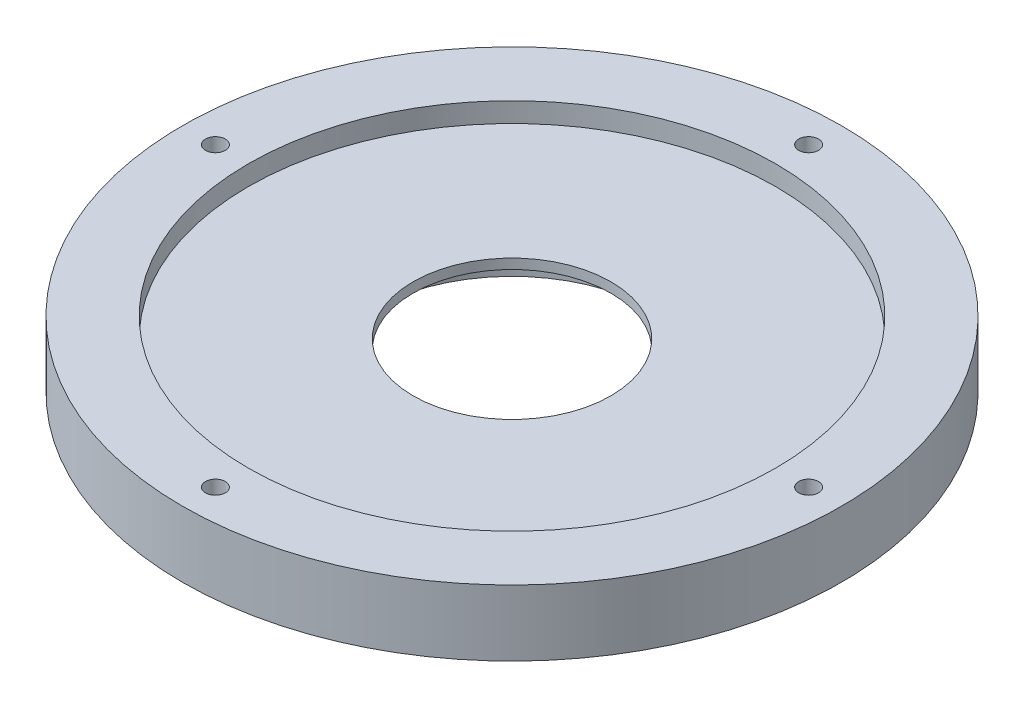
ISO-10303-21;
HEADER;
FILE_DESCRIPTION(('STEP AP214'),'2;1');
FILE_NAME('part.step','',(''),(''),'','','');
FILE_SCHEMA(('AUTOMOTIVE_DESIGN { 1 0 10303 214 1 1 1 1 }'));
ENDSEC;
DATA;
#1=APPLICATION_CONTEXT('core data for automotive mechanical design processes');
#2=APPLICATION_PROTOCOL_DEFINITION('international standard','automotive_design',2000,#1);
#3=PRODUCT_CONTEXT('',#1,'mechanical');
#4=PRODUCT('Part','Part','',(#3));
#5=PRODUCT_RELATED_PRODUCT_CATEGORY('part','',(#4));
#6=PRODUCT_DEFINITION_FORMATION('','',#4);
#7=PRODUCT_DEFINITION_CONTEXT('part definition',#1,'design');
#8=PRODUCT_DEFINITION('design','',#6,#7);
#9=PRODUCT_DEFINITION_SHAPE('','',#8);
#10=(LENGTH_UNIT() NAMED_UNIT(*) SI_UNIT(.MILLI.,.METRE.));
#11=(NAMED_UNIT(*) PLANE_ANGLE_UNIT() SI_UNIT($,.RADIAN.));
#12=(NAMED_UNIT(*) SI_UNIT($,.STERADIAN.) SOLID_ANGLE_UNIT());
#13=UNCERTAINTY_MEASURE_WITH_UNIT(LENGTH_MEASURE(1.E-05),#10,'distance_accuracy_value','');
#14=(GEOMETRIC_REPRESENTATION_CONTEXT(3) GLOBAL_UNCERTAINTY_ASSIGNED_CONTEXT((#13)) GLOBAL_UNIT_ASSIGNED_CONTEXT((#10,
#11,#12)) REPRESENTATION_CONTEXT('',''));
#15=CARTESIAN_POINT('',(0.,0.,0.));
#16=DIRECTION('',(0.,0.,1.));
#17=DIRECTION('',(1.,0.,0.));
#18=AXIS2_PLACEMENT_3D('',#15,#16,#17);
#19=CARTESIAN_POINT('',(0.,20.,0.));
#20=DIRECTION('',(0.,-1.,0.));
#21=DIRECTION('',(0.,0.,-1.));
#22=AXIS2_PLACEMENT_3D('',#19,#20,#21);
#23=CYLINDRICAL_SURFACE('',#22,30.);
#24=CARTESIAN_POINT('',(0.,11.,0.));
#25=DIRECTION('',(0.,-1.,0.));
#26=DIRECTION('',(0.,0.,-1.));
#27=AXIS2_PLACEMENT_3D('',#24,#25,#26);
#28=CIRCLE('',#27,30.);
#29=CARTESIAN_POINT('',(0.,11.,-30.));
#30=VERTEX_POINT('',#29);
#31=EDGE_CURVE('E60',#30,#30,#28,.T.);
#32=ORIENTED_EDGE('',*,*,#31,.T.);
#33=EDGE_LOOP('',(#32));
#34=FACE_BOUND('',#33,.T.);
#35=CARTESIAN_POINT('',(0.,14.,0.));
#36=DIRECTION('',(0.,1.,0.));
#37=DIRECTION('',(0.,0.,1.));
#38=AXIS2_PLACEMENT_3D('',#35,#36,#37);
#39=CIRCLE('',#38,30.);
#40=CARTESIAN_POINT('',(0.,14.,30.));
#41=VERTEX_POINT('',#40);
#42=EDGE_CURVE('E43',#41,#41,#39,.T.);
#43=ORIENTED_EDGE('',*,*,#42,.T.);
#44=EDGE_LOOP('',(#43));
#45=FACE_BOUND('',#44,.T.);
#46=ADVANCED_FACE('F39',(#34,#45),#23,.F.);
#47=CARTESIAN_POINT('',(0.,20.,0.));
#48=DIRECTION('',(0.,1.,0.));
#49=DIRECTION('',(0.,0.,1.));
#50=AXIS2_PLACEMENT_3D('',#47,#48,#49);
#51=PLANE('',#50);
#52=CARTESIAN_POINT('',(0.,20.,0.));
#53=DIRECTION('',(0.,1.,0.));
#54=DIRECTION('',(0.,0.,1.));
#55=AXIS2_PLACEMENT_3D('',#52,#53,#54);
#56=CIRCLE('',#55,80.);
#57=CARTESIAN_POINT('',(0.,20.,80.));
#58=VERTEX_POINT('',#57);
#59=EDGE_CURVE('E75',#58,#58,#56,.T.);
#60=ORIENTED_EDGE('',*,*,#59,.F.);
#61=EDGE_LOOP('',(#60));
#62=FACE_BOUND('',#61,.T.);
#63=CARTESIAN_POINT('',(-6.28466640991764E-13,20.,90.));
#64=DIRECTION('',(0.,1.,0.));
#65=DIRECTION('',(0.,0.,1.));
#66=AXIS2_PLACEMENT_3D('',#63,#64,#65);
#67=CIRCLE('',#66,3.);
#68=CARTESIAN_POINT('',(-6.28466640991764E-13,20.,93.));
#69=VERTEX_POINT('',#68);
#70=EDGE_CURVE('E78',#69,#69,#67,.T.);
#71=ORIENTED_EDGE('',*,*,#70,.F.);
#72=EDGE_LOOP('',(#71));
#73=FACE_BOUND('',#72,.T.);
#74=CARTESIAN_POINT('',(0.,20.,0.));
#75=DIRECTION('',(0.,1.,0.));
#76=DIRECTION('',(0.,0.,1.));
#77=AXIS2_PLACEMENT_3D('',#74,#75,#76);
#78=CIRCLE('',#77,100.);
#79=CARTESIAN_POINT('',(0.,20.,100.));
#80=VERTEX_POINT('',#79);
#81=EDGE_CURVE('E10',#80,#80,#78,.T.);
#82=ORIENTED_EDGE('',*,*,#81,.T.);
#83=EDGE_LOOP('',(#82));
#84=FACE_BOUND('',#83,.T.);
#85=CARTESIAN_POINT('',(0.,20.,-90.));
#86=DIRECTION('',(0.,1.,0.));
#87=DIRECTION('',(0.,0.,1.));
#88=AXIS2_PLACEMENT_3D('',#85,#86,#87);
#89=CIRCLE('',#88,3.);
#90=CARTESIAN_POINT('',(0.,20.,-87.));
#91=VERTEX_POINT('',#90);
#92=EDGE_CURVE('E55',#91,#91,#89,.T.);
#93=ORIENTED_EDGE('',*,*,#92,.F.);
#94=EDGE_LOOP('',(#93));
#95=FACE_BOUND('',#94,.T.);
#96=CARTESIAN_POINT('',(90.,20.,3.14233320495882E-13));
#97=DIRECTION('',(0.,1.,0.));
#98=DIRECTION('',(0.,0.,1.));
#99=AXIS2_PLACEMENT_3D('',#96,#97,#98);
#100=CIRCLE('',#99,3.);
#101=CARTESIAN_POINT('',(90.,20.,3.00000000000031));
#102=VERTEX_POINT('',#101);
#103=EDGE_CURVE('E87',#102,#102,#100,.T.);
#104=ORIENTED_EDGE('',*,*,#103,.F.);
#105=EDGE_LOOP('',(#104));
#106=FACE_BOUND('',#105,.T.);
#107=CARTESIAN_POINT('',(-90.,20.,-9.42699961487646E-13));
#108=DIRECTION('',(0.,1.,0.));
#109=DIRECTION('',(0.,0.,1.));
#110=AXIS2_PLACEMENT_3D('',#107,#108,#109);
#111=CIRCLE('',#110,3.);
#112=CARTESIAN_POINT('',(-90.,20.,2.99999999999906));
#113=VERTEX_POINT('',#112);
#114=EDGE_CURVE('E61',#113,#113,#111,.T.);
#115=ORIENTED_EDGE('',*,*,#114,.F.);
#116=EDGE_LOOP('',(#115));
#117=FACE_BOUND('',#116,.T.);
#118=ADVANCED_FACE('F112',(#62,#73,#84,#95,#106,#117),#51,.T.);
#119=CARTESIAN_POINT('',(0.,0.,0.));
#120=DIRECTION('',(0.,1.,0.));
#121=DIRECTION('',(0.,0.,1.));
#122=AXIS2_PLACEMENT_3D('',#119,#120,#121);
#123=PLANE('',#122);
#124=CARTESIAN_POINT('',(0.,0.,0.));
#125=DIRECTION('',(0.,-1.,0.));
#126=DIRECTION('',(0.,0.,-1.));
#127=AXIS2_PLACEMENT_3D('',#124,#125,#126);
#128=CIRCLE('',#127,43.);
#129=CARTESIAN_POINT('',(0.,0.,-43.));
#130=VERTEX_POINT('',#129);
#131=EDGE_CURVE('E70',#130,#130,#128,.T.);
#132=ORIENTED_EDGE('',*,*,#131,.F.);
#133=EDGE_LOOP('',(#132));
#134=FACE_BOUND('',#133,.T.);
#135=CARTESIAN_POINT('',(0.,0.,0.));
#136=DIRECTION('',(0.,1.,0.));
#137=DIRECTION('',(0.,0.,1.));
#138=AXIS2_PLACEMENT_3D('',#135,#136,#137);
#139=CIRCLE('',#138,100.);
#140=CARTESIAN_POINT('',(0.,0.,100.));
#141=VERTEX_POINT('',#140);
#142=EDGE_CURVE('E50',#141,#141,#139,.T.);
#143=ORIENTED_EDGE('',*,*,#142,.F.);
#144=EDGE_LOOP('',(#143));
#145=FACE_BOUND('',#144,.T.);
#146=CARTESIAN_POINT('',(0.,0.,-90.));
#147=DIRECTION('',(0.,1.,0.));
#148=DIRECTION('',(0.,0.,1.));
#149=AXIS2_PLACEMENT_3D('',#146,#147,#148);
#150=CIRCLE('',#149,3.);
#151=CARTESIAN_POINT('',(0.,0.,-87.));
#152=VERTEX_POINT('',#151);
#153=EDGE_CURVE('E54',#152,#152,#150,.T.);
#154=ORIENTED_EDGE('',*,*,#153,.T.);
#155=EDGE_LOOP('',(#154));
#156=FACE_BOUND('',#155,.T.);
#157=CARTESIAN_POINT('',(90.,0.,3.14233320495882E-13));
#158=DIRECTION('',(0.,1.,0.));
#159=DIRECTION('',(0.,0.,1.));
#160=AXIS2_PLACEMENT_3D('',#157,#158,#159);
#161=CIRCLE('',#160,3.);
#162=CARTESIAN_POINT('',(90.,0.,3.00000000000031));
#163=VERTEX_POINT('',#162);
#164=EDGE_CURVE('E84',#163,#163,#161,.T.);
#165=ORIENTED_EDGE('',*,*,#164,.T.);
#166=EDGE_LOOP('',(#165));
#167=FACE_BOUND('',#166,.T.);
#168=CARTESIAN_POINT('',(-6.28466640991764E-13,0.,90.));
#169=DIRECTION('',(0.,1.,0.));
#170=DIRECTION('',(0.,0.,1.));
#171=AXIS2_PLACEMENT_3D('',#168,#169,#170);
#172=CIRCLE('',#171,3.);
#173=CARTESIAN_POINT('',(-6.28466640991764E-13,0.,93.));
#174=VERTEX_POINT('',#173);
#175=EDGE_CURVE('E76',#174,#174,#172,.T.);
#176=ORIENTED_EDGE('',*,*,#175,.T.);
#177=EDGE_LOOP('',(#176));
#178=FACE_BOUND('',#177,.T.);
#179=CARTESIAN_POINT('',(-90.,0.,-9.42699961487646E-13));
#180=DIRECTION('',(0.,1.,0.));
#181=DIRECTION('',(0.,0.,1.));
#182=AXIS2_PLACEMENT_3D('',#179,#180,#181);
#183=CIRCLE('',#182,3.);
#184=CARTESIAN_POINT('',(-90.,0.,2.99999999999906));
#185=VERTEX_POINT('',#184);
#186=EDGE_CURVE('E56',#185,#185,#183,.T.);
#187=ORIENTED_EDGE('',*,*,#186,.T.);
#188=EDGE_LOOP('',(#187));
#189=FACE_BOUND('',#188,.T.);
#190=ADVANCED_FACE('F98',(#134,#145,#156,#167,#178,#189),#123,.F.);
#191=CARTESIAN_POINT('',(0.,20.,0.));
#192=DIRECTION('',(0.,-1.,0.));
#193=DIRECTION('',(0.,0.,-1.));
#194=AXIS2_PLACEMENT_3D('',#191,#192,#193);
#195=CYLINDRICAL_SURFACE('',#194,100.);
#196=ORIENTED_EDGE('',*,*,#81,.F.);
#197=EDGE_LOOP('',(#196));
#198=FACE_BOUND('',#197,.T.);
#199=ORIENTED_EDGE('',*,*,#142,.T.);
#200=EDGE_LOOP('',(#199));
#201=FACE_BOUND('',#200,.T.);
#202=ADVANCED_FACE('F41',(#198,#201),#195,.T.);
#203=CARTESIAN_POINT('',(0.,20.,-90.));
#204=DIRECTION('',(0.,-1.,0.));
#205=DIRECTION('',(0.,0.,-1.));
#206=AXIS2_PLACEMENT_3D('',#203,#204,#205);
#207=CYLINDRICAL_SURFACE('',#206,3.);
#208=ORIENTED_EDGE('',*,*,#92,.T.);
#209=EDGE_LOOP('',(#208));
#210=FACE_BOUND('',#209,.T.);
#211=ORIENTED_EDGE('',*,*,#153,.F.);
#212=EDGE_LOOP('',(#211));
#213=FACE_BOUND('',#212,.T.);
#214=ADVANCED_FACE('F100',(#210,#213),#207,.F.);
#215=CARTESIAN_POINT('',(90.,20.,3.14233320495882E-13));
#216=DIRECTION('',(0.,-1.,0.));
#217=DIRECTION('',(0.,0.,-1.));
#218=AXIS2_PLACEMENT_3D('',#215,#216,#217);
#219=CYLINDRICAL_SURFACE('',#218,3.);
#220=ORIENTED_EDGE('',*,*,#103,.T.);
#221=EDGE_LOOP('',(#220));
#222=FACE_BOUND('',#221,.T.);
#223=ORIENTED_EDGE('',*,*,#164,.F.);
#224=EDGE_LOOP('',(#223));
#225=FACE_BOUND('',#224,.T.);
#226=ADVANCED_FACE('F103',(#222,#225),#219,.F.);
#227=CARTESIAN_POINT('',(-6.28466640991764E-13,20.,90.));
#228=DIRECTION('',(0.,-1.,0.));
#229=DIRECTION('',(0.,0.,-1.));
#230=AXIS2_PLACEMENT_3D('',#227,#228,#229);
#231=CYLINDRICAL_SURFACE('',#230,3.);
#232=ORIENTED_EDGE('',*,*,#70,.T.);
#233=EDGE_LOOP('',(#232));
#234=FACE_BOUND('',#233,.T.);
#235=ORIENTED_EDGE('',*,*,#175,.F.);
#236=EDGE_LOOP('',(#235));
#237=FACE_BOUND('',#236,.T.);
#238=ADVANCED_FACE('F110',(#234,#237),#231,.F.);
#239=CARTESIAN_POINT('',(-90.,20.,-9.42699961487646E-13));
#240=DIRECTION('',(0.,-1.,0.));
#241=DIRECTION('',(0.,0.,-1.));
#242=AXIS2_PLACEMENT_3D('',#239,#240,#241);
#243=CYLINDRICAL_SURFACE('',#242,3.);
#244=ORIENTED_EDGE('',*,*,#114,.T.);
#245=EDGE_LOOP('',(#244));
#246=FACE_BOUND('',#245,.T.);
#247=ORIENTED_EDGE('',*,*,#186,.F.);
#248=EDGE_LOOP('',(#247));
#249=FACE_BOUND('',#248,.T.);
#250=ADVANCED_FACE('F121',(#246,#249),#243,.F.);
#251=CARTESIAN_POINT('',(0.,11.,0.));
#252=DIRECTION('',(0.,-1.,0.));
#253=DIRECTION('',(0.,0.,-1.));
#254=AXIS2_PLACEMENT_3D('',#251,#252,#253);
#255=CYLINDRICAL_SURFACE('',#254,43.);
#256=CARTESIAN_POINT('',(0.,11.,0.));
#257=DIRECTION('',(0.,-1.,0.));
#258=DIRECTION('',(0.,0.,-1.));
#259=AXIS2_PLACEMENT_3D('',#256,#257,#258);
#260=CIRCLE('',#259,43.);
#261=CARTESIAN_POINT('',(0.,11.,-43.));
#262=VERTEX_POINT('',#261);
#263=EDGE_CURVE('E58',#262,#262,#260,.T.);
#264=ORIENTED_EDGE('',*,*,#263,.F.);
#265=EDGE_LOOP('',(#264));
#266=FACE_BOUND('',#265,.T.);
#267=ORIENTED_EDGE('',*,*,#131,.T.);
#268=EDGE_LOOP('',(#267));
#269=FACE_BOUND('',#268,.T.);
#270=ADVANCED_FACE('F129',(#266,#269),#255,.F.);
#271=CARTESIAN_POINT('',(0.,11.,0.));
#272=DIRECTION('',(0.,-1.,0.));
#273=DIRECTION('',(0.,0.,-1.));
#274=AXIS2_PLACEMENT_3D('',#271,#272,#273);
#275=PLANE('',#274);
#276=ORIENTED_EDGE('',*,*,#31,.F.);
#277=EDGE_LOOP('',(#276));
#278=FACE_BOUND('',#277,.T.);
#279=ORIENTED_EDGE('',*,*,#263,.T.);
#280=EDGE_LOOP('',(#279));
#281=FACE_BOUND('',#280,.T.);
#282=ADVANCED_FACE('F135',(#278,#281),#275,.T.);
#283=CARTESIAN_POINT('',(0.,14.,0.));
#284=DIRECTION('',(0.,1.,0.));
#285=DIRECTION('',(0.,0.,1.));
#286=AXIS2_PLACEMENT_3D('',#283,#284,#285);
#287=CYLINDRICAL_SURFACE('',#286,80.);
#288=CARTESIAN_POINT('',(0.,14.,0.));
#289=DIRECTION('',(0.,1.,0.));
#290=DIRECTION('',(0.,0.,1.));
#291=AXIS2_PLACEMENT_3D('',#288,#289,#290);
#292=CIRCLE('',#291,80.);
#293=CARTESIAN_POINT('',(0.,14.,80.));
#294=VERTEX_POINT('',#293);
#295=EDGE_CURVE('E148',#294,#294,#292,.T.);
#296=ORIENTED_EDGE('',*,*,#295,.F.);
#297=EDGE_LOOP('',(#296));
#298=FACE_BOUND('',#297,.T.);
#299=ORIENTED_EDGE('',*,*,#59,.T.);
#300=EDGE_LOOP('',(#299));
#301=FACE_BOUND('',#300,.T.);
#302=ADVANCED_FACE('F133',(#298,#301),#287,.F.);
#303=CARTESIAN_POINT('',(0.,14.,0.));
#304=DIRECTION('',(0.,1.,0.));
#305=DIRECTION('',(0.,0.,1.));
#306=AXIS2_PLACEMENT_3D('',#303,#304,#305);
#307=PLANE('',#306);
#308=ORIENTED_EDGE('',*,*,#42,.F.);
#309=EDGE_LOOP('',(#308));
#310=FACE_BOUND('',#309,.T.);
#311=ORIENTED_EDGE('',*,*,#295,.T.);
#312=EDGE_LOOP('',(#311));
#313=FACE_BOUND('',#312,.T.);
#314=ADVANCED_FACE('F140',(#310,#313),#307,.T.);
#315=CLOSED_SHELL('',(#46,#118,#190,#202,#214,#226,#238,#250,#270,#282,#302,#314));
#316=MANIFOLD_SOLID_BREP('B2',#315);
#317=ADVANCED_BREP_SHAPE_REPRESENTATION('',(#18,#316),#14);
#318=SHAPE_DEFINITION_REPRESENTATION(#9,#317);
ENDSEC;
END-ISO-10303-21;
